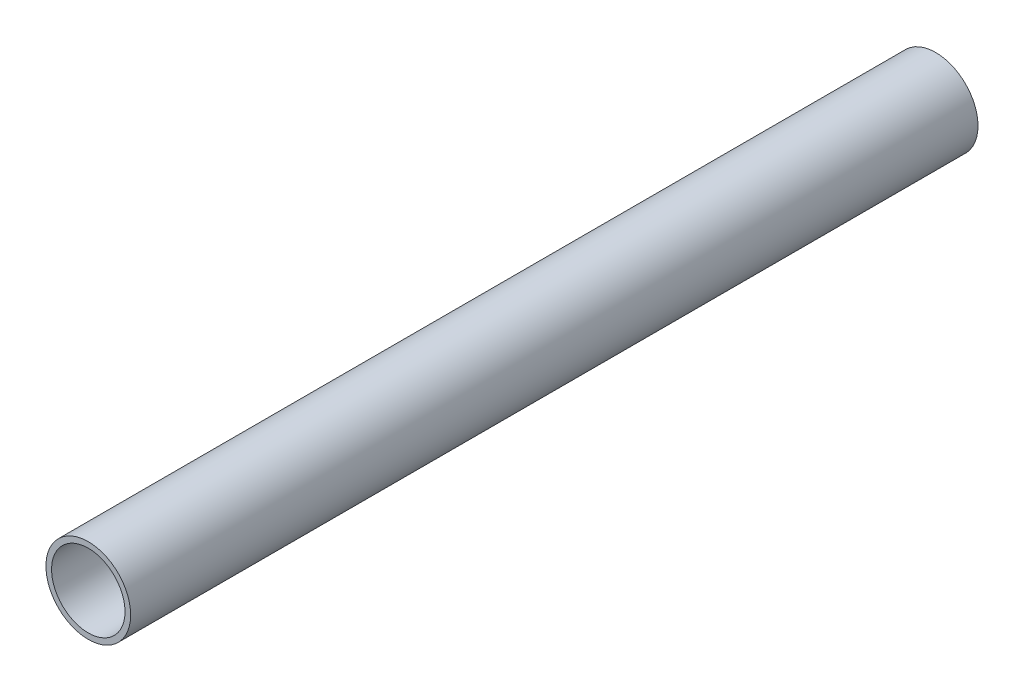
ISO-10303-21;
HEADER;
FILE_DESCRIPTION(('STEP AP214'),'2;1');
FILE_NAME('part.step','',(''),(''),'','','');
FILE_SCHEMA(('AUTOMOTIVE_DESIGN { 1 0 10303 214 1 1 1 1 }'));
ENDSEC;
DATA;
#1=APPLICATION_CONTEXT('core data for automotive mechanical design processes');
#2=APPLICATION_PROTOCOL_DEFINITION('international standard','automotive_design',2000,#1);
#3=PRODUCT_CONTEXT('',#1,'mechanical');
#4=PRODUCT('Part','Part','',(#3));
#5=PRODUCT_RELATED_PRODUCT_CATEGORY('part','',(#4));
#6=PRODUCT_DEFINITION_FORMATION('','',#4);
#7=PRODUCT_DEFINITION_CONTEXT('part definition',#1,'design');
#8=PRODUCT_DEFINITION('design','',#6,#7);
#9=PRODUCT_DEFINITION_SHAPE('','',#8);
#10=(LENGTH_UNIT() NAMED_UNIT(*) SI_UNIT(.MILLI.,.METRE.));
#11=(NAMED_UNIT(*) PLANE_ANGLE_UNIT() SI_UNIT($,.RADIAN.));
#12=(NAMED_UNIT(*) SI_UNIT($,.STERADIAN.) SOLID_ANGLE_UNIT());
#13=UNCERTAINTY_MEASURE_WITH_UNIT(LENGTH_MEASURE(1.E-05),#10,'distance_accuracy_value','');
#14=(GEOMETRIC_REPRESENTATION_CONTEXT(3) GLOBAL_UNCERTAINTY_ASSIGNED_CONTEXT((#13)) GLOBAL_UNIT_ASSIGNED_CONTEXT((#10,
#11,#12)) REPRESENTATION_CONTEXT('',''));
#15=CARTESIAN_POINT('',(0.,0.,0.));
#16=DIRECTION('',(0.,0.,1.));
#17=DIRECTION('',(1.,0.,0.));
#18=AXIS2_PLACEMENT_3D('',#15,#16,#17);
#19=CARTESIAN_POINT('',(-123.000000000001,-48.0000000000001,150.));
#20=DIRECTION('',(0.,0.,1.));
#21=DIRECTION('',(1.,0.,0.));
#22=AXIS2_PLACEMENT_3D('',#19,#20,#21);
#23=PLANE('',#22);
#24=CARTESIAN_POINT('',(-123.000000000001,-48.0000000000001,150.));
#25=DIRECTION('',(0.,0.,1.));
#26=DIRECTION('',(1.,0.,0.));
#27=AXIS2_PLACEMENT_3D('',#24,#25,#26);
#28=CIRCLE('',#27,7.50000000000001);
#29=CARTESIAN_POINT('',(-115.500000000001,-48.0000000000001,150.));
#30=VERTEX_POINT('',#29);
#31=EDGE_CURVE('E10',#30,#30,#28,.T.);
#32=ORIENTED_EDGE('',*,*,#31,.T.);
#33=EDGE_LOOP('',(#32));
#34=FACE_BOUND('',#33,.T.);
#35=CARTESIAN_POINT('',(-123.000000000001,-48.0000000000001,150.));
#36=DIRECTION('',(0.,0.,1.));
#37=DIRECTION('',(1.,0.,0.));
#38=AXIS2_PLACEMENT_3D('',#35,#36,#37);
#39=CIRCLE('',#38,6.50000000000001);
#40=CARTESIAN_POINT('',(-116.500000000001,-48.0000000000001,150.));
#41=VERTEX_POINT('',#40);
#42=EDGE_CURVE('E42',#41,#41,#39,.T.);
#43=ORIENTED_EDGE('',*,*,#42,.F.);
#44=EDGE_LOOP('',(#43));
#45=FACE_BOUND('',#44,.T.);
#46=ADVANCED_FACE('F31',(#34,#45),#23,.T.);
#47=CARTESIAN_POINT('',(-123.000000000001,-48.0000000000001,0.));
#48=DIRECTION('',(0.,0.,1.));
#49=DIRECTION('',(1.,0.,0.));
#50=AXIS2_PLACEMENT_3D('',#47,#48,#49);
#51=PLANE('',#50);
#52=CARTESIAN_POINT('',(-123.000000000001,-48.0000000000001,0.));
#53=DIRECTION('',(0.,0.,1.));
#54=DIRECTION('',(1.,0.,0.));
#55=AXIS2_PLACEMENT_3D('',#52,#53,#54);
#56=CIRCLE('',#55,7.50000000000001);
#57=CARTESIAN_POINT('',(-115.500000000001,-48.0000000000001,0.));
#58=VERTEX_POINT('',#57);
#59=EDGE_CURVE('E35',#58,#58,#56,.T.);
#60=ORIENTED_EDGE('',*,*,#59,.F.);
#61=EDGE_LOOP('',(#60));
#62=FACE_BOUND('',#61,.T.);
#63=CARTESIAN_POINT('',(-123.000000000001,-48.0000000000001,0.));
#64=DIRECTION('',(0.,0.,1.));
#65=DIRECTION('',(1.,0.,0.));
#66=AXIS2_PLACEMENT_3D('',#63,#64,#65);
#67=CIRCLE('',#66,6.50000000000001);
#68=CARTESIAN_POINT('',(-116.500000000001,-48.0000000000001,0.));
#69=VERTEX_POINT('',#68);
#70=EDGE_CURVE('E44',#69,#69,#67,.T.);
#71=ORIENTED_EDGE('',*,*,#70,.T.);
#72=EDGE_LOOP('',(#71));
#73=FACE_BOUND('',#72,.T.);
#74=ADVANCED_FACE('F54',(#62,#73),#51,.F.);
#75=CARTESIAN_POINT('',(-123.000000000001,-48.0000000000001,150.));
#76=DIRECTION('',(0.,0.,-1.));
#77=DIRECTION('',(-1.,0.,0.));
#78=AXIS2_PLACEMENT_3D('',#75,#76,#77);
#79=CYLINDRICAL_SURFACE('',#78,7.50000000000001);
#80=ORIENTED_EDGE('',*,*,#31,.F.);
#81=EDGE_LOOP('',(#80));
#82=FACE_BOUND('',#81,.T.);
#83=ORIENTED_EDGE('',*,*,#59,.T.);
#84=EDGE_LOOP('',(#83));
#85=FACE_BOUND('',#84,.T.);
#86=ADVANCED_FACE('F33',(#82,#85),#79,.T.);
#87=CARTESIAN_POINT('',(-123.000000000001,-48.0000000000001,150.));
#88=DIRECTION('',(0.,0.,-1.));
#89=DIRECTION('',(-1.,0.,0.));
#90=AXIS2_PLACEMENT_3D('',#87,#88,#89);
#91=CYLINDRICAL_SURFACE('',#90,6.50000000000001);
#92=ORIENTED_EDGE('',*,*,#42,.T.);
#93=EDGE_LOOP('',(#92));
#94=FACE_BOUND('',#93,.T.);
#95=ORIENTED_EDGE('',*,*,#70,.F.);
#96=EDGE_LOOP('',(#95));
#97=FACE_BOUND('',#96,.T.);
#98=ADVANCED_FACE('F50',(#94,#97),#91,.F.);
#99=CLOSED_SHELL('',(#46,#74,#86,#98));
#100=MANIFOLD_SOLID_BREP('B2',#99);
#101=ADVANCED_BREP_SHAPE_REPRESENTATION('',(#18,#100),#14);
#102=SHAPE_DEFINITION_REPRESENTATION(#9,#101);
ENDSEC;
END-ISO-10303-21;
